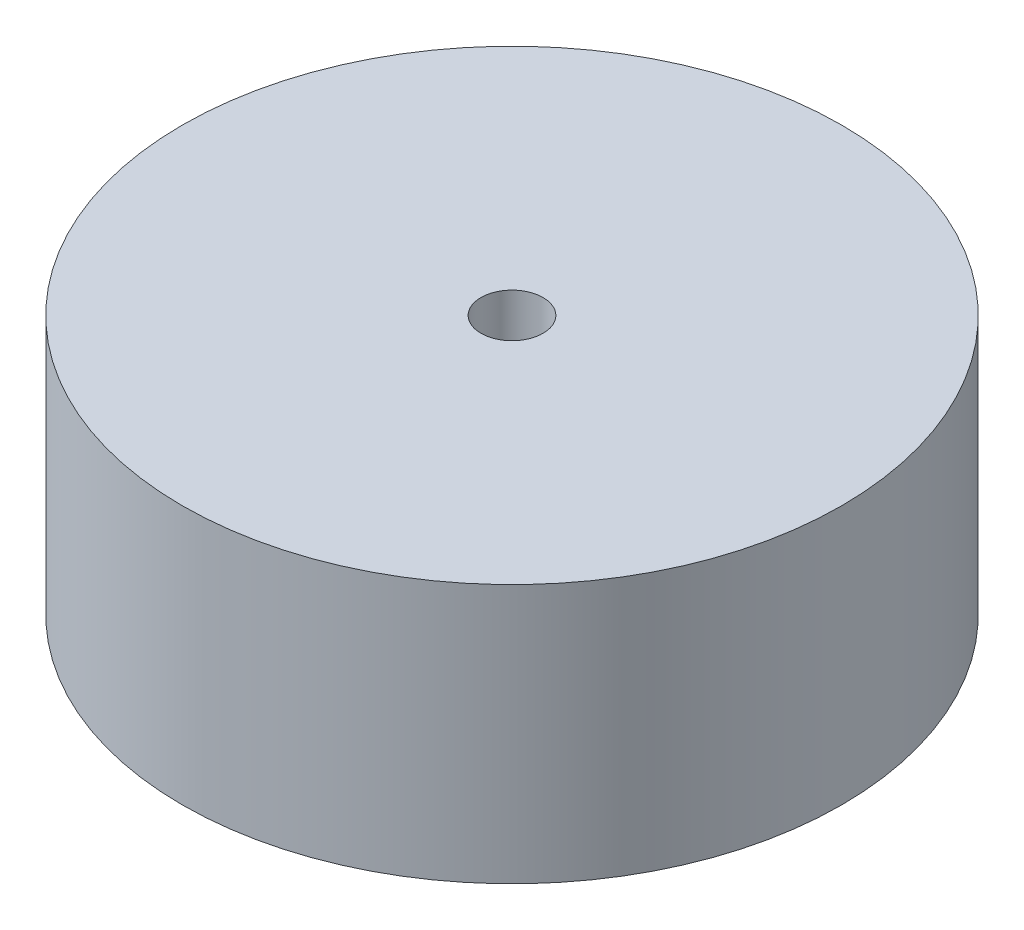
ISO-10303-21;
HEADER;
FILE_DESCRIPTION(('STEP AP214'),'2;1');
FILE_NAME('part.step','',(''),(''),'','','');
FILE_SCHEMA(('AUTOMOTIVE_DESIGN { 1 0 10303 214 1 1 1 1 }'));
ENDSEC;
DATA;
#1=APPLICATION_CONTEXT('core data for automotive mechanical design processes');
#2=APPLICATION_PROTOCOL_DEFINITION('international standard','automotive_design',2000,#1);
#3=PRODUCT_CONTEXT('',#1,'mechanical');
#4=PRODUCT('Part','Part','',(#3));
#5=PRODUCT_RELATED_PRODUCT_CATEGORY('part','',(#4));
#6=PRODUCT_DEFINITION_FORMATION('','',#4);
#7=PRODUCT_DEFINITION_CONTEXT('part definition',#1,'design');
#8=PRODUCT_DEFINITION('design','',#6,#7);
#9=PRODUCT_DEFINITION_SHAPE('','',#8);
#10=(LENGTH_UNIT() NAMED_UNIT(*) SI_UNIT(.MILLI.,.METRE.));
#11=(NAMED_UNIT(*) PLANE_ANGLE_UNIT() SI_UNIT($,.RADIAN.));
#12=(NAMED_UNIT(*) SI_UNIT($,.STERADIAN.) SOLID_ANGLE_UNIT());
#13=UNCERTAINTY_MEASURE_WITH_UNIT(LENGTH_MEASURE(1.E-05),#10,'distance_accuracy_value','');
#14=(GEOMETRIC_REPRESENTATION_CONTEXT(3) GLOBAL_UNCERTAINTY_ASSIGNED_CONTEXT((#13)) GLOBAL_UNIT_ASSIGNED_CONTEXT((#10,
#11,#12)) REPRESENTATION_CONTEXT('',''));
#15=CARTESIAN_POINT('',(0.,0.,0.));
#16=DIRECTION('',(0.,0.,1.));
#17=DIRECTION('',(1.,0.,0.));
#18=AXIS2_PLACEMENT_3D('',#15,#16,#17);
#19=CARTESIAN_POINT('',(0.,-16.7,0.));
#20=DIRECTION('',(0.,1.,0.));
#21=DIRECTION('',(0.,0.,1.));
#22=AXIS2_PLACEMENT_3D('',#19,#20,#21);
#23=CYLINDRICAL_SURFACE('',#22,42.5);
#24=CARTESIAN_POINT('',(0.,-16.7,0.));
#25=DIRECTION('',(0.,1.,0.));
#26=DIRECTION('',(0.,0.,1.));
#27=AXIS2_PLACEMENT_3D('',#24,#25,#26);
#28=CIRCLE('',#27,42.5);
#29=CARTESIAN_POINT('',(0.,-16.7,42.5));
#30=VERTEX_POINT('',#29);
#31=EDGE_CURVE('E10',#30,#30,#28,.T.);
#32=ORIENTED_EDGE('',*,*,#31,.T.);
#33=EDGE_LOOP('',(#32));
#34=FACE_BOUND('',#33,.T.);
#35=CARTESIAN_POINT('',(0.,16.7,0.));
#36=DIRECTION('',(0.,1.,0.));
#37=DIRECTION('',(0.,0.,1.));
#38=AXIS2_PLACEMENT_3D('',#35,#36,#37);
#39=CIRCLE('',#38,42.5);
#40=CARTESIAN_POINT('',(0.,16.7,42.5));
#41=VERTEX_POINT('',#40);
#42=EDGE_CURVE('E40',#41,#41,#39,.T.);
#43=ORIENTED_EDGE('',*,*,#42,.F.);
#44=EDGE_LOOP('',(#43));
#45=FACE_BOUND('',#44,.T.);
#46=ADVANCED_FACE('F30',(#34,#45),#23,.T.);
#47=CARTESIAN_POINT('',(0.,-16.7,0.));
#48=DIRECTION('',(0.,1.,0.));
#49=DIRECTION('',(0.,0.,1.));
#50=AXIS2_PLACEMENT_3D('',#47,#48,#49);
#51=PLANE('',#50);
#52=CARTESIAN_POINT('',(0.,-16.7,0.));
#53=DIRECTION('',(0.,1.,0.));
#54=DIRECTION('',(0.,0.,1.));
#55=AXIS2_PLACEMENT_3D('',#52,#53,#54);
#56=CIRCLE('',#55,4.);
#57=CARTESIAN_POINT('',(0.,-16.7,4.));
#58=VERTEX_POINT('',#57);
#59=EDGE_CURVE('E36',#58,#58,#56,.T.);
#60=ORIENTED_EDGE('',*,*,#59,.T.);
#61=EDGE_LOOP('',(#60));
#62=FACE_BOUND('',#61,.T.);
#63=ORIENTED_EDGE('',*,*,#31,.F.);
#64=EDGE_LOOP('',(#63));
#65=FACE_BOUND('',#64,.T.);
#66=ADVANCED_FACE('F59',(#62,#65),#51,.F.);
#67=CARTESIAN_POINT('',(0.,-16.7,0.));
#68=DIRECTION('',(0.,1.,0.));
#69=DIRECTION('',(0.,0.,1.));
#70=AXIS2_PLACEMENT_3D('',#67,#68,#69);
#71=CYLINDRICAL_SURFACE('',#70,4.);
#72=ORIENTED_EDGE('',*,*,#59,.F.);
#73=EDGE_LOOP('',(#72));
#74=FACE_BOUND('',#73,.T.);
#75=CARTESIAN_POINT('',(0.,16.7,0.));
#76=DIRECTION('',(0.,1.,0.));
#77=DIRECTION('',(0.,0.,1.));
#78=AXIS2_PLACEMENT_3D('',#75,#76,#77);
#79=CIRCLE('',#78,4.);
#80=CARTESIAN_POINT('',(0.,16.7,4.));
#81=VERTEX_POINT('',#80);
#82=EDGE_CURVE('E44',#81,#81,#79,.T.);
#83=ORIENTED_EDGE('',*,*,#82,.T.);
#84=EDGE_LOOP('',(#83));
#85=FACE_BOUND('',#84,.T.);
#86=ADVANCED_FACE('F50',(#74,#85),#71,.F.);
#87=CARTESIAN_POINT('',(0.,16.7,0.));
#88=DIRECTION('',(0.,1.,0.));
#89=DIRECTION('',(0.,0.,1.));
#90=AXIS2_PLACEMENT_3D('',#87,#88,#89);
#91=PLANE('',#90);
#92=ORIENTED_EDGE('',*,*,#42,.T.);
#93=EDGE_LOOP('',(#92));
#94=FACE_BOUND('',#93,.T.);
#95=ORIENTED_EDGE('',*,*,#82,.F.);
#96=EDGE_LOOP('',(#95));
#97=FACE_BOUND('',#96,.T.);
#98=ADVANCED_FACE('F52',(#94,#97),#91,.T.);
#99=CLOSED_SHELL('',(#46,#66,#86,#98));
#100=MANIFOLD_SOLID_BREP('B2',#99);
#101=ADVANCED_BREP_SHAPE_REPRESENTATION('',(#18,#100),#14);
#102=SHAPE_DEFINITION_REPRESENTATION(#9,#101);
ENDSEC;
END-ISO-10303-21;
